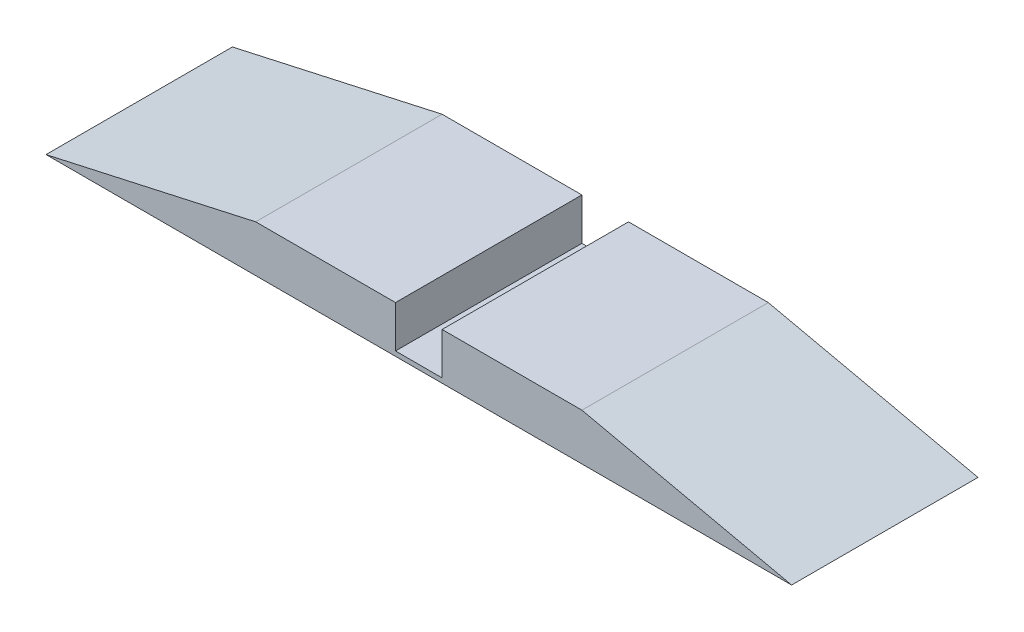
ISO-10303-21;
HEADER;
FILE_DESCRIPTION(('STEP AP214'),'2;1');
FILE_NAME('part.step','',(''),(''),'','','');
FILE_SCHEMA(('AUTOMOTIVE_DESIGN { 1 0 10303 214 1 1 1 1 }'));
ENDSEC;
DATA;
#1=APPLICATION_CONTEXT('core data for automotive mechanical design processes');
#2=APPLICATION_PROTOCOL_DEFINITION('international standard','automotive_design',2000,#1);
#3=PRODUCT_CONTEXT('',#1,'mechanical');
#4=PRODUCT('Part','Part','',(#3));
#5=PRODUCT_RELATED_PRODUCT_CATEGORY('part','',(#4));
#6=PRODUCT_DEFINITION_FORMATION('','',#4);
#7=PRODUCT_DEFINITION_CONTEXT('part definition',#1,'design');
#8=PRODUCT_DEFINITION('design','',#6,#7);
#9=PRODUCT_DEFINITION_SHAPE('','',#8);
#10=(LENGTH_UNIT() NAMED_UNIT(*) SI_UNIT(.MILLI.,.METRE.));
#11=(NAMED_UNIT(*) PLANE_ANGLE_UNIT() SI_UNIT($,.RADIAN.));
#12=(NAMED_UNIT(*) SI_UNIT($,.STERADIAN.) SOLID_ANGLE_UNIT());
#13=UNCERTAINTY_MEASURE_WITH_UNIT(LENGTH_MEASURE(1.E-05),#10,'distance_accuracy_value','');
#14=(GEOMETRIC_REPRESENTATION_CONTEXT(3) GLOBAL_UNCERTAINTY_ASSIGNED_CONTEXT((#13)) GLOBAL_UNIT_ASSIGNED_CONTEXT((#10,
#11,#12)) REPRESENTATION_CONTEXT('',''));
#15=CARTESIAN_POINT('',(0.,0.,0.));
#16=DIRECTION('',(0.,0.,1.));
#17=DIRECTION('',(1.,0.,0.));
#18=AXIS2_PLACEMENT_3D('',#15,#16,#17);
#19=CARTESIAN_POINT('',(0.,-225.,-1000.));
#20=DIRECTION('',(0.,-1.,0.));
#21=DIRECTION('',(0.,0.,-1.));
#22=AXIS2_PLACEMENT_3D('',#19,#20,#21);
#23=PLANE('',#22);
#24=DIRECTION('',(0.,0.,1.));
#25=VECTOR('',#24,1.);
#26=CARTESIAN_POINT('',(-250.,-225.,-1000.));
#27=LINE('',#26,#25);
#28=CARTESIAN_POINT('',(-250.,-225.,-1000.));
#29=VERTEX_POINT('',#28);
#30=CARTESIAN_POINT('',(-250.,-225.,1000.));
#31=VERTEX_POINT('',#30);
#32=EDGE_CURVE('E38',#29,#31,#27,.T.);
#33=ORIENTED_EDGE('',*,*,#32,.T.);
#34=DIRECTION('',(1.,0.,0.));
#35=VECTOR('',#34,1.);
#36=CARTESIAN_POINT('',(0.,-225.,1000.));
#37=LINE('',#36,#35);
#38=CARTESIAN_POINT('',(250.,-225.,1000.));
#39=VERTEX_POINT('',#38);
#40=EDGE_CURVE('E100',#31,#39,#37,.T.);
#41=ORIENTED_EDGE('',*,*,#40,.T.);
#42=DIRECTION('',(0.,0.,1.));
#43=VECTOR('',#42,1.);
#44=CARTESIAN_POINT('',(250.,-225.,-1000.));
#45=LINE('',#44,#43);
#46=CARTESIAN_POINT('',(250.,-225.,-1000.));
#47=VERTEX_POINT('',#46);
#48=EDGE_CURVE('E11',#47,#39,#45,.T.);
#49=ORIENTED_EDGE('',*,*,#48,.F.);
#50=DIRECTION('',(1.,0.,0.));
#51=VECTOR('',#50,1.);
#52=CARTESIAN_POINT('',(0.,-225.,-1000.));
#53=LINE('',#52,#51);
#54=EDGE_CURVE('E102',#29,#47,#53,.T.);
#55=ORIENTED_EDGE('',*,*,#54,.F.);
#56=EDGE_LOOP('',(#33,#41,#49,#55));
#57=FACE_BOUND('',#56,.T.);
#58=ADVANCED_FACE('F35',(#57),#23,.F.);
#59=CARTESIAN_POINT('',(250.,0.,-1000.));
#60=DIRECTION('',(1.,0.,0.));
#61=DIRECTION('',(0.,0.,-1.));
#62=AXIS2_PLACEMENT_3D('',#59,#60,#61);
#63=PLANE('',#62);
#64=ORIENTED_EDGE('',*,*,#48,.T.);
#65=DIRECTION('',(0.,1.,0.));
#66=VECTOR('',#65,1.);
#67=CARTESIAN_POINT('',(250.,0.,1000.));
#68=LINE('',#67,#66);
#69=CARTESIAN_POINT('',(250.,225.,1000.));
#70=VERTEX_POINT('',#69);
#71=EDGE_CURVE('E118',#39,#70,#68,.T.);
#72=ORIENTED_EDGE('',*,*,#71,.T.);
#73=DIRECTION('',(0.,0.,1.));
#74=VECTOR('',#73,1.);
#75=CARTESIAN_POINT('',(250.,225.,-1000.));
#76=LINE('',#75,#74);
#77=CARTESIAN_POINT('',(250.,225.,-1000.));
#78=VERTEX_POINT('',#77);
#79=EDGE_CURVE('E43',#78,#70,#76,.T.);
#80=ORIENTED_EDGE('',*,*,#79,.F.);
#81=DIRECTION('',(0.,1.,0.));
#82=VECTOR('',#81,1.);
#83=CARTESIAN_POINT('',(250.,0.,-1000.));
#84=LINE('',#83,#82);
#85=EDGE_CURVE('E50',#47,#78,#84,.T.);
#86=ORIENTED_EDGE('',*,*,#85,.F.);
#87=EDGE_LOOP('',(#64,#72,#80,#86));
#88=FACE_BOUND('',#87,.T.);
#89=ADVANCED_FACE('F180',(#88),#63,.F.);
#90=CARTESIAN_POINT('',(0.,225.,-1000.));
#91=DIRECTION('',(0.,-1.,0.));
#92=DIRECTION('',(1.,0.,0.));
#93=AXIS2_PLACEMENT_3D('',#90,#91,#92);
#94=PLANE('',#93);
#95=ORIENTED_EDGE('',*,*,#79,.T.);
#96=DIRECTION('',(1.,0.,0.));
#97=VECTOR('',#96,1.);
#98=CARTESIAN_POINT('',(0.,225.,1000.));
#99=LINE('',#98,#97);
#100=CARTESIAN_POINT('',(1750.,225.,1000.));
#101=VERTEX_POINT('',#100);
#102=EDGE_CURVE('E131',#70,#101,#99,.T.);
#103=ORIENTED_EDGE('',*,*,#102,.T.);
#104=DIRECTION('',(0.,0.,1.));
#105=VECTOR('',#104,1.);
#106=CARTESIAN_POINT('',(1750.,225.,-1000.));
#107=LINE('',#106,#105);
#108=CARTESIAN_POINT('',(1750.,225.,-1000.));
#109=VERTEX_POINT('',#108);
#110=EDGE_CURVE('E152',#109,#101,#107,.T.);
#111=ORIENTED_EDGE('',*,*,#110,.F.);
#112=DIRECTION('',(1.,0.,0.));
#113=VECTOR('',#112,1.);
#114=CARTESIAN_POINT('',(0.,225.,-1000.));
#115=LINE('',#114,#113);
#116=EDGE_CURVE('E148',#78,#109,#115,.T.);
#117=ORIENTED_EDGE('',*,*,#116,.F.);
#118=EDGE_LOOP('',(#95,#103,#111,#117));
#119=FACE_BOUND('',#118,.T.);
#120=ADVANCED_FACE('F179',(#119),#94,.F.);
#121=CARTESIAN_POINT('',(130.,585.,-1000.));
#122=DIRECTION('',(-0.216930457818656,-0.976187060183953,0.));
#123=DIRECTION('',(0.976187060183953,-0.216930457818656,0.));
#124=AXIS2_PLACEMENT_3D('',#121,#122,#123);
#125=PLANE('',#124);
#126=ORIENTED_EDGE('',*,*,#110,.T.);
#127=DIRECTION('',(0.976187060183953,-0.216930457818656,0.));
#128=VECTOR('',#127,1.);
#129=CARTESIAN_POINT('',(130.,585.,1000.));
#130=LINE('',#129,#128);
#131=CARTESIAN_POINT('',(4000.,-275.,1000.));
#132=VERTEX_POINT('',#131);
#133=EDGE_CURVE('E128',#101,#132,#130,.T.);
#134=ORIENTED_EDGE('',*,*,#133,.T.);
#135=DIRECTION('',(0.,0.,1.));
#136=VECTOR('',#135,1.);
#137=CARTESIAN_POINT('',(4000.,-275.,-1000.));
#138=LINE('',#137,#136);
#139=CARTESIAN_POINT('',(4000.,-275.,-1000.));
#140=VERTEX_POINT('',#139);
#141=EDGE_CURVE('E154',#140,#132,#138,.T.);
#142=ORIENTED_EDGE('',*,*,#141,.F.);
#143=DIRECTION('',(0.976187060183953,-0.216930457818656,0.));
#144=VECTOR('',#143,1.);
#145=CARTESIAN_POINT('',(130.,585.,-1000.));
#146=LINE('',#145,#144);
#147=EDGE_CURVE('E146',#109,#140,#146,.T.);
#148=ORIENTED_EDGE('',*,*,#147,.F.);
#149=EDGE_LOOP('',(#126,#134,#142,#148));
#150=FACE_BOUND('',#149,.T.);
#151=ADVANCED_FACE('F174',(#150),#125,.F.);
#152=CARTESIAN_POINT('',(0.,-275.,-1000.));
#153=DIRECTION('',(0.,1.,0.));
#154=DIRECTION('',(-1.,0.,0.));
#155=AXIS2_PLACEMENT_3D('',#152,#153,#154);
#156=PLANE('',#155);
#157=ORIENTED_EDGE('',*,*,#141,.T.);
#158=DIRECTION('',(-1.,0.,0.));
#159=VECTOR('',#158,1.);
#160=CARTESIAN_POINT('',(0.,-275.,1000.));
#161=LINE('',#160,#159);
#162=CARTESIAN_POINT('',(-4000.,-275.,1000.));
#163=VERTEX_POINT('',#162);
#164=EDGE_CURVE('E125',#132,#163,#161,.T.);
#165=ORIENTED_EDGE('',*,*,#164,.T.);
#166=DIRECTION('',(0.,0.,1.));
#167=VECTOR('',#166,1.);
#168=CARTESIAN_POINT('',(-4000.,-275.,-1000.));
#169=LINE('',#168,#167);
#170=CARTESIAN_POINT('',(-4000.,-275.,-1000.));
#171=VERTEX_POINT('',#170);
#172=EDGE_CURVE('E156',#171,#163,#169,.T.);
#173=ORIENTED_EDGE('',*,*,#172,.F.);
#174=DIRECTION('',(-1.,0.,0.));
#175=VECTOR('',#174,1.);
#176=CARTESIAN_POINT('',(0.,-275.,-1000.));
#177=LINE('',#176,#175);
#178=EDGE_CURVE('E144',#140,#171,#177,.T.);
#179=ORIENTED_EDGE('',*,*,#178,.F.);
#180=EDGE_LOOP('',(#157,#165,#173,#179));
#181=FACE_BOUND('',#180,.T.);
#182=ADVANCED_FACE('F170',(#181),#156,.F.);
#183=CARTESIAN_POINT('',(-130.,585.,-1000.));
#184=DIRECTION('',(-0.216930457818656,0.976187060183953,0.));
#185=DIRECTION('',(-0.976187060183953,-0.216930457818656,0.));
#186=AXIS2_PLACEMENT_3D('',#183,#184,#185);
#187=PLANE('',#186);
#188=ORIENTED_EDGE('',*,*,#172,.T.);
#189=DIRECTION('',(-0.976187060183953,-0.216930457818656,0.));
#190=VECTOR('',#189,1.);
#191=CARTESIAN_POINT('',(-130.,585.,1000.));
#192=LINE('',#191,#190);
#193=CARTESIAN_POINT('',(-1750.,225.,1000.));
#194=VERTEX_POINT('',#193);
#195=EDGE_CURVE('E122',#194,#163,#192,.T.);
#196=ORIENTED_EDGE('',*,*,#195,.F.);
#197=DIRECTION('',(0.,0.,1.));
#198=VECTOR('',#197,1.);
#199=CARTESIAN_POINT('',(-1750.,225.,-1000.));
#200=LINE('',#199,#198);
#201=CARTESIAN_POINT('',(-1750.,225.,-1000.));
#202=VERTEX_POINT('',#201);
#203=EDGE_CURVE('E158',#202,#194,#200,.T.);
#204=ORIENTED_EDGE('',*,*,#203,.F.);
#205=DIRECTION('',(-0.976187060183953,-0.216930457818656,0.));
#206=VECTOR('',#205,1.);
#207=CARTESIAN_POINT('',(-130.,585.,-1000.));
#208=LINE('',#207,#206);
#209=EDGE_CURVE('E141',#202,#171,#208,.T.);
#210=ORIENTED_EDGE('',*,*,#209,.T.);
#211=EDGE_LOOP('',(#188,#196,#204,#210));
#212=FACE_BOUND('',#211,.T.);
#213=ADVANCED_FACE('F166',(#212),#187,.T.);
#214=CARTESIAN_POINT('',(0.,225.,-1000.));
#215=DIRECTION('',(0.,1.,0.));
#216=DIRECTION('',(-1.,0.,0.));
#217=AXIS2_PLACEMENT_3D('',#214,#215,#216);
#218=PLANE('',#217);
#219=ORIENTED_EDGE('',*,*,#203,.T.);
#220=DIRECTION('',(-1.,0.,0.));
#221=VECTOR('',#220,1.);
#222=CARTESIAN_POINT('',(0.,225.,1000.));
#223=LINE('',#222,#221);
#224=CARTESIAN_POINT('',(-250.,225.,1000.));
#225=VERTEX_POINT('',#224);
#226=EDGE_CURVE('E113',#225,#194,#223,.T.);
#227=ORIENTED_EDGE('',*,*,#226,.F.);
#228=DIRECTION('',(0.,0.,1.));
#229=VECTOR('',#228,1.);
#230=CARTESIAN_POINT('',(-250.,225.,-1000.));
#231=LINE('',#230,#229);
#232=CARTESIAN_POINT('',(-250.,225.,-1000.));
#233=VERTEX_POINT('',#232);
#234=EDGE_CURVE('E106',#233,#225,#231,.T.);
#235=ORIENTED_EDGE('',*,*,#234,.F.);
#236=DIRECTION('',(-1.,0.,0.));
#237=VECTOR('',#236,1.);
#238=CARTESIAN_POINT('',(0.,225.,-1000.));
#239=LINE('',#238,#237);
#240=EDGE_CURVE('E138',#233,#202,#239,.T.);
#241=ORIENTED_EDGE('',*,*,#240,.T.);
#242=EDGE_LOOP('',(#219,#227,#235,#241));
#243=FACE_BOUND('',#242,.T.);
#244=ADVANCED_FACE('F160',(#243),#218,.T.);
#245=CARTESIAN_POINT('',(-250.,0.,-1000.));
#246=DIRECTION('',(1.,0.,0.));
#247=DIRECTION('',(0.,0.,-1.));
#248=AXIS2_PLACEMENT_3D('',#245,#246,#247);
#249=PLANE('',#248);
#250=ORIENTED_EDGE('',*,*,#234,.T.);
#251=DIRECTION('',(0.,1.,0.));
#252=VECTOR('',#251,1.);
#253=CARTESIAN_POINT('',(-250.,0.,1000.));
#254=LINE('',#253,#252);
#255=EDGE_CURVE('E108',#31,#225,#254,.T.);
#256=ORIENTED_EDGE('',*,*,#255,.F.);
#257=ORIENTED_EDGE('',*,*,#32,.F.);
#258=DIRECTION('',(0.,1.,0.));
#259=VECTOR('',#258,1.);
#260=CARTESIAN_POINT('',(-250.,0.,-1000.));
#261=LINE('',#260,#259);
#262=EDGE_CURVE('E136',#29,#233,#261,.T.);
#263=ORIENTED_EDGE('',*,*,#262,.T.);
#264=EDGE_LOOP('',(#250,#256,#257,#263));
#265=FACE_BOUND('',#264,.T.);
#266=ADVANCED_FACE('F109',(#265),#249,.T.);
#267=CARTESIAN_POINT('',(0.,0.,-1000.));
#268=DIRECTION('',(0.,0.,1.));
#269=DIRECTION('',(1.,0.,0.));
#270=AXIS2_PLACEMENT_3D('',#267,#268,#269);
#271=PLANE('',#270);
#272=ORIENTED_EDGE('',*,*,#54,.T.);
#273=ORIENTED_EDGE('',*,*,#85,.T.);
#274=ORIENTED_EDGE('',*,*,#116,.T.);
#275=ORIENTED_EDGE('',*,*,#147,.T.);
#276=ORIENTED_EDGE('',*,*,#178,.T.);
#277=ORIENTED_EDGE('',*,*,#209,.F.);
#278=ORIENTED_EDGE('',*,*,#240,.F.);
#279=ORIENTED_EDGE('',*,*,#262,.F.);
#280=EDGE_LOOP('',(#272,#273,#274,#275,#276,#277,#278,#279));
#281=FACE_BOUND('',#280,.T.);
#282=ADVANCED_FACE('F189',(#281),#271,.F.);
#283=CARTESIAN_POINT('',(0.,0.,1000.));
#284=DIRECTION('',(0.,0.,1.));
#285=DIRECTION('',(1.,0.,0.));
#286=AXIS2_PLACEMENT_3D('',#283,#284,#285);
#287=PLANE('',#286);
#288=ORIENTED_EDGE('',*,*,#40,.F.);
#289=ORIENTED_EDGE('',*,*,#255,.T.);
#290=ORIENTED_EDGE('',*,*,#226,.T.);
#291=ORIENTED_EDGE('',*,*,#195,.T.);
#292=ORIENTED_EDGE('',*,*,#164,.F.);
#293=ORIENTED_EDGE('',*,*,#133,.F.);
#294=ORIENTED_EDGE('',*,*,#102,.F.);
#295=ORIENTED_EDGE('',*,*,#71,.F.);
#296=EDGE_LOOP('',(#288,#289,#290,#291,#292,#293,#294,#295));
#297=FACE_BOUND('',#296,.T.);
#298=ADVANCED_FACE('F115',(#297),#287,.T.);
#299=CLOSED_SHELL('',(#58,#89,#120,#151,#182,#213,#244,#266,#282,#298));
#300=MANIFOLD_SOLID_BREP('B2',#299);
#301=ADVANCED_BREP_SHAPE_REPRESENTATION('',(#18,#300),#14);
#302=SHAPE_DEFINITION_REPRESENTATION(#9,#301);
ENDSEC;
END-ISO-10303-21;
